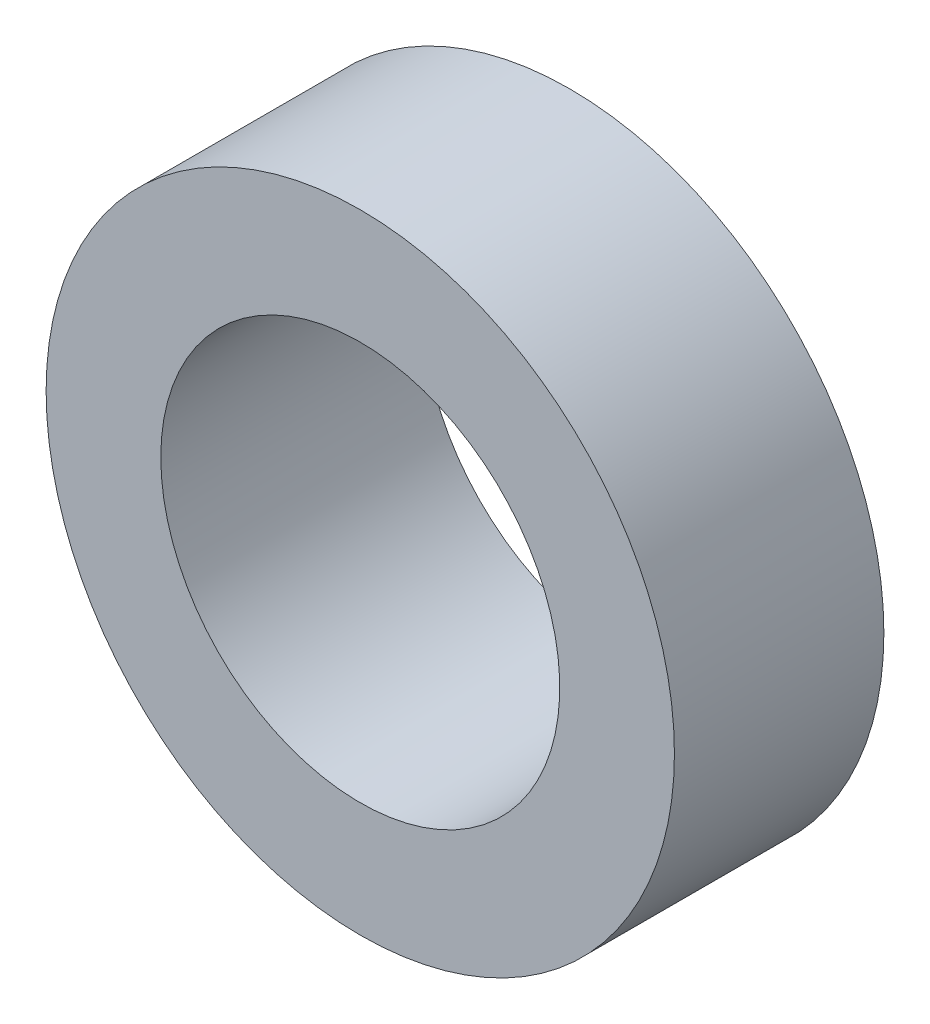
ISO-10303-21;
HEADER;
FILE_DESCRIPTION(('STEP AP214'),'2;1');
FILE_NAME('part.step','',(''),(''),'','','');
FILE_SCHEMA(('AUTOMOTIVE_DESIGN { 1 0 10303 214 1 1 1 1 }'));
ENDSEC;
DATA;
#1=APPLICATION_CONTEXT('core data for automotive mechanical design processes');
#2=APPLICATION_PROTOCOL_DEFINITION('international standard','automotive_design',2000,#1);
#3=PRODUCT_CONTEXT('',#1,'mechanical');
#4=PRODUCT('Part','Part','',(#3));
#5=PRODUCT_RELATED_PRODUCT_CATEGORY('part','',(#4));
#6=PRODUCT_DEFINITION_FORMATION('','',#4);
#7=PRODUCT_DEFINITION_CONTEXT('part definition',#1,'design');
#8=PRODUCT_DEFINITION('design','',#6,#7);
#9=PRODUCT_DEFINITION_SHAPE('','',#8);
#10=(LENGTH_UNIT() NAMED_UNIT(*) SI_UNIT(.MILLI.,.METRE.));
#11=(NAMED_UNIT(*) PLANE_ANGLE_UNIT() SI_UNIT($,.RADIAN.));
#12=(NAMED_UNIT(*) SI_UNIT($,.STERADIAN.) SOLID_ANGLE_UNIT());
#13=UNCERTAINTY_MEASURE_WITH_UNIT(LENGTH_MEASURE(1.E-05),#10,'distance_accuracy_value','');
#14=(GEOMETRIC_REPRESENTATION_CONTEXT(3) GLOBAL_UNCERTAINTY_ASSIGNED_CONTEXT((#13)) GLOBAL_UNIT_ASSIGNED_CONTEXT((#10,
#11,#12)) REPRESENTATION_CONTEXT('',''));
#15=CARTESIAN_POINT('',(0.,0.,0.));
#16=DIRECTION('',(0.,0.,1.));
#17=DIRECTION('',(1.,0.,0.));
#18=AXIS2_PLACEMENT_3D('',#15,#16,#17);
#19=CARTESIAN_POINT('',(0.,0.,29.));
#20=DIRECTION('',(0.,0.,-1.));
#21=DIRECTION('',(-1.,0.,0.));
#22=AXIS2_PLACEMENT_3D('',#19,#20,#21);
#23=CYLINDRICAL_SURFACE('',#22,19.05);
#24=CARTESIAN_POINT('',(0.,0.,0.));
#25=DIRECTION('',(0.,0.,-1.));
#26=DIRECTION('',(-1.,0.,0.));
#27=AXIS2_PLACEMENT_3D('',#24,#25,#26);
#28=CIRCLE('',#27,19.05);
#29=CARTESIAN_POINT('',(-19.05,0.,0.));
#30=VERTEX_POINT('',#29);
#31=EDGE_CURVE('E10',#30,#30,#28,.T.);
#32=ORIENTED_EDGE('',*,*,#31,.T.);
#33=EDGE_LOOP('',(#32));
#34=FACE_BOUND('',#33,.T.);
#35=CARTESIAN_POINT('',(0.,0.,25.));
#36=DIRECTION('',(0.,0.,-1.));
#37=DIRECTION('',(-1.,0.,0.));
#38=AXIS2_PLACEMENT_3D('',#35,#36,#37);
#39=CIRCLE('',#38,19.05);
#40=CARTESIAN_POINT('',(-19.05,0.,25.));
#41=VERTEX_POINT('',#40);
#42=EDGE_CURVE('E52',#41,#41,#39,.T.);
#43=ORIENTED_EDGE('',*,*,#42,.F.);
#44=EDGE_LOOP('',(#43));
#45=FACE_BOUND('',#44,.T.);
#46=ADVANCED_FACE('F31',(#34,#45),#23,.F.);
#47=CARTESIAN_POINT('',(0.,0.,0.));
#48=DIRECTION('',(0.,0.,1.));
#49=DIRECTION('',(1.,0.,0.));
#50=AXIS2_PLACEMENT_3D('',#47,#48,#49);
#51=PLANE('',#50);
#52=ORIENTED_EDGE('',*,*,#31,.F.);
#53=EDGE_LOOP('',(#52));
#54=FACE_BOUND('',#53,.T.);
#55=CARTESIAN_POINT('',(0.,0.,0.));
#56=DIRECTION('',(0.,0.,-1.));
#57=DIRECTION('',(-1.,0.,0.));
#58=AXIS2_PLACEMENT_3D('',#55,#56,#57);
#59=CIRCLE('',#58,20.5);
#60=CARTESIAN_POINT('',(-20.5,0.,0.));
#61=VERTEX_POINT('',#60);
#62=EDGE_CURVE('E42',#61,#61,#59,.T.);
#63=ORIENTED_EDGE('',*,*,#62,.T.);
#64=EDGE_LOOP('',(#63));
#65=FACE_BOUND('',#64,.T.);
#66=ADVANCED_FACE('F33',(#54,#65),#51,.F.);
#67=CARTESIAN_POINT('',(0.,0.,5.));
#68=DIRECTION('',(0.,0.,-1.));
#69=DIRECTION('',(-1.,0.,0.));
#70=AXIS2_PLACEMENT_3D('',#67,#68,#69);
#71=PLANE('',#70);
#72=CARTESIAN_POINT('',(0.,0.,5.));
#73=DIRECTION('',(0.,0.,-1.));
#74=DIRECTION('',(-1.,0.,0.));
#75=AXIS2_PLACEMENT_3D('',#72,#73,#74);
#76=CIRCLE('',#75,20.5);
#77=CARTESIAN_POINT('',(-20.5,0.,5.));
#78=VERTEX_POINT('',#77);
#79=EDGE_CURVE('E38',#78,#78,#76,.T.);
#80=ORIENTED_EDGE('',*,*,#79,.F.);
#81=EDGE_LOOP('',(#80));
#82=FACE_BOUND('',#81,.T.);
#83=CARTESIAN_POINT('',(0.,0.,4.99999999999999));
#84=DIRECTION('',(0.,0.,1.));
#85=DIRECTION('',(1.,0.,0.));
#86=AXIS2_PLACEMENT_3D('',#83,#84,#85);
#87=CIRCLE('',#86,30.);
#88=CARTESIAN_POINT('',(30.,0.,4.99999999999999));
#89=VERTEX_POINT('',#88);
#90=EDGE_CURVE('E47',#89,#89,#87,.T.);
#91=ORIENTED_EDGE('',*,*,#90,.F.);
#92=EDGE_LOOP('',(#91));
#93=FACE_BOUND('',#92,.T.);
#94=ADVANCED_FACE('F66',(#82,#93),#71,.T.);
#95=CARTESIAN_POINT('',(0.,0.,5.));
#96=DIRECTION('',(0.,0.,-1.));
#97=DIRECTION('',(-1.,0.,0.));
#98=AXIS2_PLACEMENT_3D('',#95,#96,#97);
#99=CYLINDRICAL_SURFACE('',#98,20.5);
#100=ORIENTED_EDGE('',*,*,#79,.T.);
#101=EDGE_LOOP('',(#100));
#102=FACE_BOUND('',#101,.T.);
#103=ORIENTED_EDGE('',*,*,#62,.F.);
#104=EDGE_LOOP('',(#103));
#105=FACE_BOUND('',#104,.T.);
#106=ADVANCED_FACE('F75',(#102,#105),#99,.T.);
#107=CARTESIAN_POINT('',(0.,0.,4.99999999999999));
#108=DIRECTION('',(0.,0.,1.));
#109=DIRECTION('',(1.,0.,0.));
#110=AXIS2_PLACEMENT_3D('',#107,#108,#109);
#111=CYLINDRICAL_SURFACE('',#110,30.);
#112=CARTESIAN_POINT('',(0.,0.,25.));
#113=DIRECTION('',(0.,0.,1.));
#114=DIRECTION('',(1.,0.,0.));
#115=AXIS2_PLACEMENT_3D('',#112,#113,#114);
#116=CIRCLE('',#115,30.);
#117=CARTESIAN_POINT('',(30.,0.,25.));
#118=VERTEX_POINT('',#117);
#119=EDGE_CURVE('E49',#118,#118,#116,.T.);
#120=CARTESIAN_POINT('',(30.,0.,4.99999999999999));
#121=CARTESIAN_POINT('',(30.,0.,5.20833333333333));
#122=CARTESIAN_POINT('',(30.,0.,5.41666666666666));
#123=CARTESIAN_POINT('',(30.,0.,5.83333333333333));
#124=CARTESIAN_POINT('',(30.,0.,6.04166666666666));
#125=CARTESIAN_POINT('',(30.,0.,6.45833333333333));
#126=CARTESIAN_POINT('',(30.,0.,6.66666666666666));
#127=CARTESIAN_POINT('',(30.,0.,7.08333333333333));
#128=CARTESIAN_POINT('',(30.,0.,7.29166666666666));
#129=CARTESIAN_POINT('',(30.,0.,7.70833333333333));
#130=CARTESIAN_POINT('',(30.,0.,7.91666666666666));
#131=CARTESIAN_POINT('',(30.,0.,8.33333333333333));
#132=CARTESIAN_POINT('',(30.,0.,8.54166666666666));
#133=CARTESIAN_POINT('',(30.,0.,8.95833333333333));
#134=CARTESIAN_POINT('',(30.,0.,9.16666666666666));
#135=CARTESIAN_POINT('',(30.,0.,9.58333333333333));
#136=CARTESIAN_POINT('',(30.,0.,9.79166666666666));
#137=CARTESIAN_POINT('',(30.,0.,10.2083333333333));
#138=CARTESIAN_POINT('',(30.,0.,10.4166666666667));
#139=CARTESIAN_POINT('',(30.,0.,10.8333333333333));
#140=CARTESIAN_POINT('',(30.,0.,11.0416666666667));
#141=CARTESIAN_POINT('',(30.,0.,11.4583333333333));
#142=CARTESIAN_POINT('',(30.,0.,11.6666666666667));
#143=CARTESIAN_POINT('',(30.,0.,12.0833333333333));
#144=CARTESIAN_POINT('',(30.,0.,12.2916666666667));
#145=CARTESIAN_POINT('',(30.,0.,12.7083333333333));
#146=CARTESIAN_POINT('',(30.,0.,12.9166666666667));
#147=CARTESIAN_POINT('',(30.,0.,13.3333333333333));
#148=CARTESIAN_POINT('',(30.,0.,13.5416666666667));
#149=CARTESIAN_POINT('',(30.,0.,13.9583333333333));
#150=CARTESIAN_POINT('',(30.,0.,14.1666666666667));
#151=CARTESIAN_POINT('',(30.,0.,14.5833333333333));
#152=CARTESIAN_POINT('',(30.,0.,14.7916666666667));
#153=CARTESIAN_POINT('',(30.,0.,15.2083333333333));
#154=CARTESIAN_POINT('',(30.,0.,15.4166666666667));
#155=CARTESIAN_POINT('',(30.,0.,15.8333333333333));
#156=CARTESIAN_POINT('',(30.,0.,16.0416666666667));
#157=CARTESIAN_POINT('',(30.,0.,16.4583333333333));
#158=CARTESIAN_POINT('',(30.,0.,16.6666666666667));
#159=CARTESIAN_POINT('',(30.,0.,17.0833333333333));
#160=CARTESIAN_POINT('',(30.,0.,17.2916666666667));
#161=CARTESIAN_POINT('',(30.,0.,17.7083333333333));
#162=CARTESIAN_POINT('',(30.,0.,17.9166666666667));
#163=CARTESIAN_POINT('',(30.,0.,18.3333333333333));
#164=CARTESIAN_POINT('',(30.,0.,18.5416666666667));
#165=CARTESIAN_POINT('',(30.,0.,18.9583333333333));
#166=CARTESIAN_POINT('',(30.,0.,19.1666666666667));
#167=CARTESIAN_POINT('',(30.,0.,19.5833333333333));
#168=CARTESIAN_POINT('',(30.,0.,19.7916666666667));
#169=CARTESIAN_POINT('',(30.,0.,20.2083333333333));
#170=CARTESIAN_POINT('',(30.,0.,20.4166666666667));
#171=CARTESIAN_POINT('',(30.,0.,20.8333333333333));
#172=CARTESIAN_POINT('',(30.,0.,21.0416666666667));
#173=CARTESIAN_POINT('',(30.,0.,21.4583333333333));
#174=CARTESIAN_POINT('',(30.,0.,21.6666666666667));
#175=CARTESIAN_POINT('',(30.,0.,22.0833333333333));
#176=CARTESIAN_POINT('',(30.,0.,22.2916666666667));
#177=CARTESIAN_POINT('',(30.,0.,22.7083333333333));
#178=CARTESIAN_POINT('',(30.,0.,22.9166666666667));
#179=CARTESIAN_POINT('',(30.,0.,23.3333333333333));
#180=CARTESIAN_POINT('',(30.,0.,23.5416666666667));
#181=CARTESIAN_POINT('',(30.,0.,23.9583333333333));
#182=CARTESIAN_POINT('',(30.,0.,24.1666666666667));
#183=CARTESIAN_POINT('',(30.,0.,24.5833333333333));
#184=CARTESIAN_POINT('',(30.,0.,24.7916666666667));
#185=CARTESIAN_POINT('',(30.,0.,25.));
#186=B_SPLINE_CURVE_WITH_KNOTS('',3,(#120,#121,#122,#123,#124,#125,#126,#127,#128,#129,#130,
#131,#132,#133,#134,#135,#136,#137,#138,#139,#140,#141,#142,#143,#144,#145,#146,#147,#148,#149,
#150,#151,#152,#153,#154,#155,#156,#157,#158,#159,#160,#161,#162,#163,#164,#165,#166,#167,#168,
#169,#170,#171,#172,#173,#174,#175,#176,#177,#178,#179,#180,#181,#182,#183,#184,#185),
.UNSPECIFIED.,.F.,.F.,(4,2,2,2,2,2,2,2,2,2,2,2,2,2,2,2,2,2,2,2,2,2,2,2,2,2,2,2,2,2,2,2,4),(0.,
0.625000000000001,1.25,1.875,2.5,3.125,3.75,4.375,5.,5.625,6.25,6.875,7.5,8.125,8.75,
9.37500000000001,10.,10.625,11.25,11.875,12.5,13.125,13.75,14.375,15.,15.625,16.25,16.875,17.5,
18.125,18.75,19.375,20.),.UNSPECIFIED.);
#187=EDGE_CURVE('BSEAM71',#89,#118,#186,.T.);
#188=ORIENTED_EDGE('',*,*,#90,.T.);
#189=ORIENTED_EDGE('',*,*,#119,.F.);
#190=ORIENTED_EDGE('',*,*,#187,.T.);
#191=ORIENTED_EDGE('',*,*,#187,.F.);
#192=EDGE_LOOP('',(#188,#190,#189,#191));
#193=FACE_BOUND('',#192,.T.);
#194=ADVANCED_FACE('F71',(#193),#111,.T.);
#195=CARTESIAN_POINT('',(0.,0.,25.));
#196=DIRECTION('',(0.,0.,1.));
#197=DIRECTION('',(1.,0.,0.));
#198=AXIS2_PLACEMENT_3D('',#195,#196,#197);
#199=PLANE('',#198);
#200=ORIENTED_EDGE('',*,*,#42,.T.);
#201=EDGE_LOOP('',(#200));
#202=FACE_BOUND('',#201,.T.);
#203=ORIENTED_EDGE('',*,*,#119,.T.);
#204=EDGE_LOOP('',(#203));
#205=FACE_BOUND('',#204,.T.);
#206=ADVANCED_FACE('F58',(#202,#205),#199,.T.);
#207=CLOSED_SHELL('',(#46,#66,#94,#106,#194,#206));
#208=MANIFOLD_SOLID_BREP('B2',#207);
#209=ADVANCED_BREP_SHAPE_REPRESENTATION('',(#18,#208),#14);
#210=SHAPE_DEFINITION_REPRESENTATION(#9,#209);
ENDSEC;
END-ISO-10303-21;
